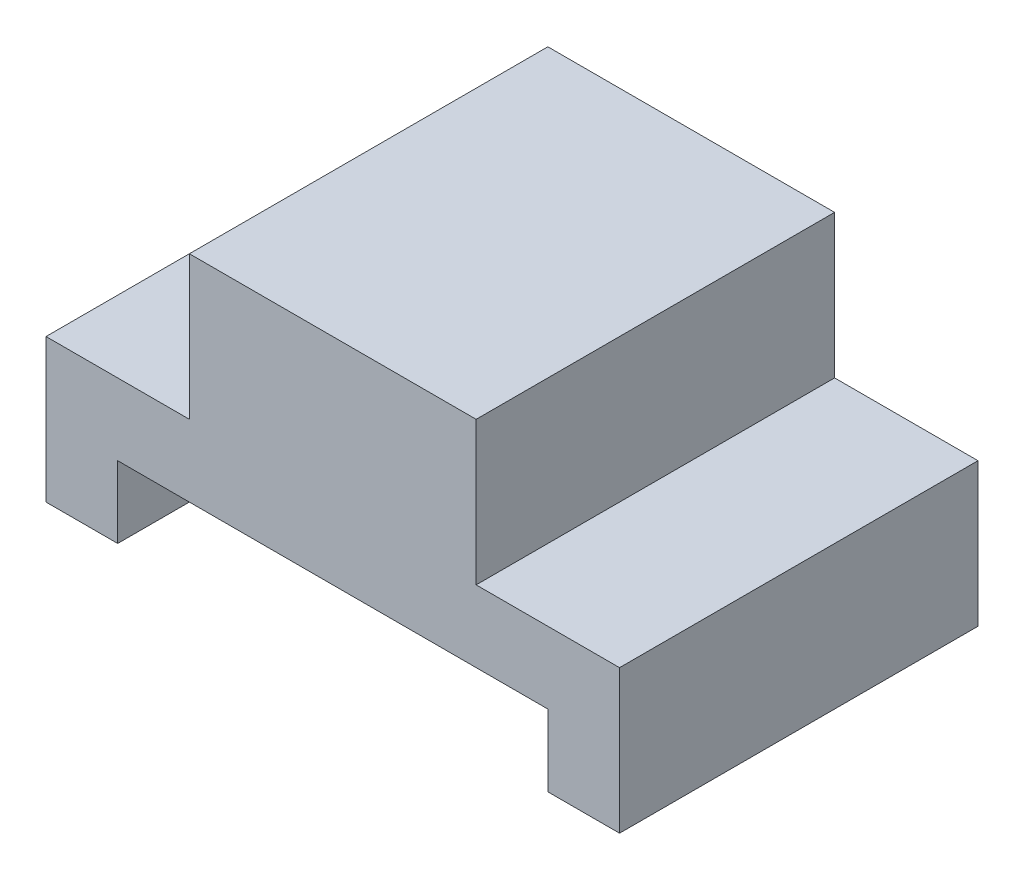
ISO-10303-21;
HEADER;
FILE_DESCRIPTION(('STEP AP214'),'2;1');
FILE_NAME('part.step','',(''),(''),'','','');
FILE_SCHEMA(('AUTOMOTIVE_DESIGN { 1 0 10303 214 1 1 1 1 }'));
ENDSEC;
DATA;
#1=APPLICATION_CONTEXT('core data for automotive mechanical design processes');
#2=APPLICATION_PROTOCOL_DEFINITION('international standard','automotive_design',2000,#1);
#3=PRODUCT_CONTEXT('',#1,'mechanical');
#4=PRODUCT('Part','Part','',(#3));
#5=PRODUCT_RELATED_PRODUCT_CATEGORY('part','',(#4));
#6=PRODUCT_DEFINITION_FORMATION('','',#4);
#7=PRODUCT_DEFINITION_CONTEXT('part definition',#1,'design');
#8=PRODUCT_DEFINITION('design','',#6,#7);
#9=PRODUCT_DEFINITION_SHAPE('','',#8);
#10=(LENGTH_UNIT() NAMED_UNIT(*) SI_UNIT(.MILLI.,.METRE.));
#11=(NAMED_UNIT(*) PLANE_ANGLE_UNIT() SI_UNIT($,.RADIAN.));
#12=(NAMED_UNIT(*) SI_UNIT($,.STERADIAN.) SOLID_ANGLE_UNIT());
#13=UNCERTAINTY_MEASURE_WITH_UNIT(LENGTH_MEASURE(1.E-05),#10,'distance_accuracy_value','');
#14=(GEOMETRIC_REPRESENTATION_CONTEXT(3) GLOBAL_UNCERTAINTY_ASSIGNED_CONTEXT((#13)) GLOBAL_UNIT_ASSIGNED_CONTEXT((#10,
#11,#12)) REPRESENTATION_CONTEXT('',''));
#15=CARTESIAN_POINT('',(0.,0.,0.));
#16=DIRECTION('',(0.,0.,1.));
#17=DIRECTION('',(1.,0.,0.));
#18=AXIS2_PLACEMENT_3D('',#15,#16,#17);
#19=CARTESIAN_POINT('',(0.,0.,0.));
#20=DIRECTION('',(0.,-1.,0.));
#21=DIRECTION('',(0.,0.,-1.));
#22=AXIS2_PLACEMENT_3D('',#19,#20,#21);
#23=PLANE('',#22);
#24=DIRECTION('',(-1.,0.,0.));
#25=VECTOR('',#24,1.);
#26=CARTESIAN_POINT('',(-7950.,0.,-199.46825096806));
#27=LINE('',#26,#25);
#28=CARTESIAN_POINT('',(-950.,0.,-199.46825096806));
#29=VERTEX_POINT('',#28);
#30=CARTESIAN_POINT('',(-6950.,0.,-199.46825096806));
#31=VERTEX_POINT('',#30);
#32=EDGE_CURVE('E53',#29,#31,#27,.T.);
#33=ORIENTED_EDGE('',*,*,#32,.F.);
#34=DIRECTION('',(0.,0.,-1.));
#35=VECTOR('',#34,1.);
#36=CARTESIAN_POINT('',(-950.000000000001,0.,4800.53174903194));
#37=LINE('',#36,#35);
#38=CARTESIAN_POINT('',(-950.000000000001,0.,4800.53174903194));
#39=VERTEX_POINT('',#38);
#40=EDGE_CURVE('E144',#39,#29,#37,.T.);
#41=ORIENTED_EDGE('',*,*,#40,.F.);
#42=DIRECTION('',(1.,0.,0.));
#43=VECTOR('',#42,1.);
#44=CARTESIAN_POINT('',(-7950.,0.,4800.53174903194));
#45=LINE('',#44,#43);
#46=CARTESIAN_POINT('',(-6950.,0.,4800.53174903194));
#47=VERTEX_POINT('',#46);
#48=EDGE_CURVE('E202',#47,#39,#45,.T.);
#49=ORIENTED_EDGE('',*,*,#48,.F.);
#50=DIRECTION('',(0.,0.,1.));
#51=VECTOR('',#50,1.);
#52=CARTESIAN_POINT('',(-6950.,0.,4800.53174903194));
#53=LINE('',#52,#51);
#54=EDGE_CURVE('E148',#31,#47,#53,.T.);
#55=ORIENTED_EDGE('',*,*,#54,.F.);
#56=EDGE_LOOP('',(#33,#41,#49,#55));
#57=FACE_BOUND('',#56,.T.);
#58=ADVANCED_FACE('F38',(#57),#23,.T.);
#59=CARTESIAN_POINT('',(0.,1000.,0.));
#60=DIRECTION('',(0.,-1.,0.));
#61=DIRECTION('',(0.,0.,-1.));
#62=AXIS2_PLACEMENT_3D('',#59,#60,#61);
#63=PLANE('',#62);
#64=DIRECTION('',(0.,0.,1.));
#65=VECTOR('',#64,1.);
#66=CARTESIAN_POINT('',(-5950.,1000.,-199.46825096806));
#67=LINE('',#66,#65);
#68=CARTESIAN_POINT('',(-5950.,1000.,-199.46825096806));
#69=VERTEX_POINT('',#68);
#70=CARTESIAN_POINT('',(-5950.,1000.,4800.53174903194));
#71=VERTEX_POINT('',#70);
#72=EDGE_CURVE('E173',#69,#71,#67,.T.);
#73=ORIENTED_EDGE('',*,*,#72,.F.);
#74=DIRECTION('',(-1.,0.,0.));
#75=VECTOR('',#74,1.);
#76=CARTESIAN_POINT('',(-7950.,1000.,-199.46825096806));
#77=LINE('',#76,#75);
#78=CARTESIAN_POINT('',(-7950.,1000.,-199.46825096806));
#79=VERTEX_POINT('',#78);
#80=EDGE_CURVE('E201',#69,#79,#77,.T.);
#81=ORIENTED_EDGE('',*,*,#80,.T.);
#82=DIRECTION('',(0.,0.,1.));
#83=VECTOR('',#82,1.);
#84=CARTESIAN_POINT('',(-7950.,1000.,4800.53174903194));
#85=LINE('',#84,#83);
#86=CARTESIAN_POINT('',(-7950.,1000.,4800.53174903194));
#87=VERTEX_POINT('',#86);
#88=EDGE_CURVE('E205',#79,#87,#85,.T.);
#89=ORIENTED_EDGE('',*,*,#88,.T.);
#90=DIRECTION('',(1.,0.,0.));
#91=VECTOR('',#90,1.);
#92=CARTESIAN_POINT('',(-7950.,1000.,4800.53174903194));
#93=LINE('',#92,#91);
#94=EDGE_CURVE('E208',#87,#71,#93,.T.);
#95=ORIENTED_EDGE('',*,*,#94,.T.);
#96=EDGE_LOOP('',(#73,#81,#89,#95));
#97=FACE_BOUND('',#96,.T.);
#98=ADVANCED_FACE('F235',(#97),#63,.F.);
#99=DIRECTION('',(0.,0.,-1.));
#100=VECTOR('',#99,1.);
#101=CARTESIAN_POINT('',(-1950.,1000.,-199.46825096806));
#102=LINE('',#101,#100);
#103=CARTESIAN_POINT('',(-1950.,1000.,4800.53174903194));
#104=VERTEX_POINT('',#103);
#105=CARTESIAN_POINT('',(-1950.,1000.,-199.46825096806));
#106=VERTEX_POINT('',#105);
#107=EDGE_CURVE('E61',#104,#106,#102,.T.);
#108=ORIENTED_EDGE('',*,*,#107,.F.);
#109=CARTESIAN_POINT('',(49.9999999999998,1000.,4800.53174903194));
#110=VERTEX_POINT('',#109);
#111=EDGE_CURVE('E207',#104,#110,#93,.T.);
#112=ORIENTED_EDGE('',*,*,#111,.T.);
#113=DIRECTION('',(0.,0.,-1.));
#114=VECTOR('',#113,1.);
#115=CARTESIAN_POINT('',(49.9999999999998,1000.,4800.53174903194));
#116=LINE('',#115,#114);
#117=CARTESIAN_POINT('',(49.9999999999998,1000.,-199.46825096806));
#118=VERTEX_POINT('',#117);
#119=EDGE_CURVE('E198',#110,#118,#116,.T.);
#120=ORIENTED_EDGE('',*,*,#119,.T.);
#121=EDGE_CURVE('E203',#118,#106,#77,.T.);
#122=ORIENTED_EDGE('',*,*,#121,.T.);
#123=EDGE_LOOP('',(#108,#112,#120,#122));
#124=FACE_BOUND('',#123,.T.);
#125=ADVANCED_FACE('F250',(#124),#63,.F.);
#126=CARTESIAN_POINT('',(49.9999999999998,1000.,4800.53174903194));
#127=DIRECTION('',(-1.,0.,0.));
#128=DIRECTION('',(0.,0.,1.));
#129=AXIS2_PLACEMENT_3D('',#126,#127,#128);
#130=PLANE('',#129);
#131=DIRECTION('',(0.,-1.,0.));
#132=VECTOR('',#131,1.);
#133=CARTESIAN_POINT('',(49.9999999999998,1000.,4800.53174903194));
#134=LINE('',#133,#132);
#135=CARTESIAN_POINT('',(49.9999999999998,-1000.,4800.53174903194));
#136=VERTEX_POINT('',#135);
#137=EDGE_CURVE('E210',#110,#136,#134,.T.);
#138=ORIENTED_EDGE('',*,*,#137,.T.);
#139=DIRECTION('',(0.,0.,1.));
#140=VECTOR('',#139,1.);
#141=CARTESIAN_POINT('',(49.9999999999998,-1000.,4800.53174903194));
#142=LINE('',#141,#140);
#143=CARTESIAN_POINT('',(49.9999999999998,-1000.,-199.46825096806));
#144=VERTEX_POINT('',#143);
#145=EDGE_CURVE('E135',#144,#136,#142,.T.);
#146=ORIENTED_EDGE('',*,*,#145,.F.);
#147=DIRECTION('',(0.,-1.,0.));
#148=VECTOR('',#147,1.);
#149=CARTESIAN_POINT('',(49.9999999999998,1000.,-199.46825096806));
#150=LINE('',#149,#148);
#151=EDGE_CURVE('E11',#118,#144,#150,.T.);
#152=ORIENTED_EDGE('',*,*,#151,.F.);
#153=ORIENTED_EDGE('',*,*,#119,.F.);
#154=EDGE_LOOP('',(#138,#146,#152,#153));
#155=FACE_BOUND('',#154,.T.);
#156=ADVANCED_FACE('F40',(#155),#130,.F.);
#157=CARTESIAN_POINT('',(-7950.,1000.,-199.46825096806));
#158=DIRECTION('',(0.,0.,1.));
#159=DIRECTION('',(1.,0.,0.));
#160=AXIS2_PLACEMENT_3D('',#157,#158,#159);
#161=PLANE('',#160);
#162=ORIENTED_EDGE('',*,*,#151,.T.);
#163=DIRECTION('',(1.,0.,0.));
#164=VECTOR('',#163,1.);
#165=CARTESIAN_POINT('',(-950.,-1000.,-199.46825096806));
#166=LINE('',#165,#164);
#167=CARTESIAN_POINT('',(-950.,-1000.,-199.46825096806));
#168=VERTEX_POINT('',#167);
#169=EDGE_CURVE('E125',#168,#144,#166,.T.);
#170=ORIENTED_EDGE('',*,*,#169,.F.);
#171=DIRECTION('',(0.,1.,0.));
#172=VECTOR('',#171,1.);
#173=CARTESIAN_POINT('',(-950.,-1000.,-199.46825096806));
#174=LINE('',#173,#172);
#175=EDGE_CURVE('E129',#168,#29,#174,.T.);
#176=ORIENTED_EDGE('',*,*,#175,.T.);
#177=ORIENTED_EDGE('',*,*,#32,.T.);
#178=DIRECTION('',(0.,1.,0.));
#179=VECTOR('',#178,1.);
#180=CARTESIAN_POINT('',(-6950.,-1000.,-199.46825096806));
#181=LINE('',#180,#179);
#182=CARTESIAN_POINT('',(-6950.,-1000.,-199.46825096806));
#183=VERTEX_POINT('',#182);
#184=EDGE_CURVE('E166',#183,#31,#181,.T.);
#185=ORIENTED_EDGE('',*,*,#184,.F.);
#186=DIRECTION('',(1.,0.,0.));
#187=VECTOR('',#186,1.);
#188=CARTESIAN_POINT('',(-6950.,-1000.,-199.46825096806));
#189=LINE('',#188,#187);
#190=CARTESIAN_POINT('',(-7950.,-1000.,-199.46825096806));
#191=VERTEX_POINT('',#190);
#192=EDGE_CURVE('E165',#191,#183,#189,.T.);
#193=ORIENTED_EDGE('',*,*,#192,.F.);
#194=DIRECTION('',(0.,-1.,0.));
#195=VECTOR('',#194,1.);
#196=CARTESIAN_POINT('',(-7950.,1000.,-199.46825096806));
#197=LINE('',#196,#195);
#198=EDGE_CURVE('E46',#79,#191,#197,.T.);
#199=ORIENTED_EDGE('',*,*,#198,.F.);
#200=ORIENTED_EDGE('',*,*,#80,.F.);
#201=DIRECTION('',(0.,-1.,0.));
#202=VECTOR('',#201,1.);
#203=CARTESIAN_POINT('',(-5950.,3000.,-199.46825096806));
#204=LINE('',#203,#202);
#205=CARTESIAN_POINT('',(-5950.,3000.,-199.46825096806));
#206=VERTEX_POINT('',#205);
#207=EDGE_CURVE('E183',#206,#69,#204,.T.);
#208=ORIENTED_EDGE('',*,*,#207,.F.);
#209=DIRECTION('',(-1.,0.,0.));
#210=VECTOR('',#209,1.);
#211=CARTESIAN_POINT('',(-5950.,3000.,-199.46825096806));
#212=LINE('',#211,#210);
#213=CARTESIAN_POINT('',(-1950.,3000.,-199.46825096806));
#214=VERTEX_POINT('',#213);
#215=EDGE_CURVE('E181',#214,#206,#212,.T.);
#216=ORIENTED_EDGE('',*,*,#215,.F.);
#217=DIRECTION('',(0.,-1.,0.));
#218=VECTOR('',#217,1.);
#219=CARTESIAN_POINT('',(-1950.,3000.,-199.46825096806));
#220=LINE('',#219,#218);
#221=EDGE_CURVE('E189',#214,#106,#220,.T.);
#222=ORIENTED_EDGE('',*,*,#221,.T.);
#223=ORIENTED_EDGE('',*,*,#121,.F.);
#224=EDGE_LOOP('',(#162,#170,#176,#177,#185,#193,#199,#200,#208,#216,#222,#223));
#225=FACE_BOUND('',#224,.T.);
#226=ADVANCED_FACE('F127',(#225),#161,.F.);
#227=CARTESIAN_POINT('',(-7950.,1000.,4800.53174903194));
#228=DIRECTION('',(1.,0.,0.));
#229=DIRECTION('',(0.,0.,-1.));
#230=AXIS2_PLACEMENT_3D('',#227,#228,#229);
#231=PLANE('',#230);
#232=ORIENTED_EDGE('',*,*,#198,.T.);
#233=DIRECTION('',(0.,0.,-1.));
#234=VECTOR('',#233,1.);
#235=CARTESIAN_POINT('',(-7950.,-1000.,4800.53174903194));
#236=LINE('',#235,#234);
#237=CARTESIAN_POINT('',(-7950.,-1000.,4800.53174903194));
#238=VERTEX_POINT('',#237);
#239=EDGE_CURVE('E162',#238,#191,#236,.T.);
#240=ORIENTED_EDGE('',*,*,#239,.F.);
#241=DIRECTION('',(0.,-1.,0.));
#242=VECTOR('',#241,1.);
#243=CARTESIAN_POINT('',(-7950.,1000.,4800.53174903194));
#244=LINE('',#243,#242);
#245=EDGE_CURVE('E215',#87,#238,#244,.T.);
#246=ORIENTED_EDGE('',*,*,#245,.F.);
#247=ORIENTED_EDGE('',*,*,#88,.F.);
#248=EDGE_LOOP('',(#232,#240,#246,#247));
#249=FACE_BOUND('',#248,.T.);
#250=ADVANCED_FACE('F220',(#249),#231,.F.);
#251=CARTESIAN_POINT('',(-7950.,1000.,4800.53174903194));
#252=DIRECTION('',(0.,0.,-1.));
#253=DIRECTION('',(-1.,0.,0.));
#254=AXIS2_PLACEMENT_3D('',#251,#252,#253);
#255=PLANE('',#254);
#256=ORIENTED_EDGE('',*,*,#245,.T.);
#257=DIRECTION('',(-1.,0.,0.));
#258=VECTOR('',#257,1.);
#259=CARTESIAN_POINT('',(-6950.,-1000.,4800.53174903194));
#260=LINE('',#259,#258);
#261=CARTESIAN_POINT('',(-6950.,-1000.,4800.53174903194));
#262=VERTEX_POINT('',#261);
#263=EDGE_CURVE('E159',#262,#238,#260,.T.);
#264=ORIENTED_EDGE('',*,*,#263,.F.);
#265=DIRECTION('',(0.,1.,0.));
#266=VECTOR('',#265,1.);
#267=CARTESIAN_POINT('',(-6950.,-1000.,4800.53174903194));
#268=LINE('',#267,#266);
#269=EDGE_CURVE('E170',#262,#47,#268,.T.);
#270=ORIENTED_EDGE('',*,*,#269,.T.);
#271=ORIENTED_EDGE('',*,*,#48,.T.);
#272=DIRECTION('',(0.,1.,0.));
#273=VECTOR('',#272,1.);
#274=CARTESIAN_POINT('',(-950.000000000001,-1000.,4800.53174903194));
#275=LINE('',#274,#273);
#276=CARTESIAN_POINT('',(-950.000000000001,-1000.,4800.53174903194));
#277=VERTEX_POINT('',#276);
#278=EDGE_CURVE('E149',#277,#39,#275,.T.);
#279=ORIENTED_EDGE('',*,*,#278,.F.);
#280=DIRECTION('',(-1.,0.,0.));
#281=VECTOR('',#280,1.);
#282=CARTESIAN_POINT('',(-950.000000000001,-1000.,4800.53174903194));
#283=LINE('',#282,#281);
#284=EDGE_CURVE('E141',#136,#277,#283,.T.);
#285=ORIENTED_EDGE('',*,*,#284,.F.);
#286=ORIENTED_EDGE('',*,*,#137,.F.);
#287=ORIENTED_EDGE('',*,*,#111,.F.);
#288=DIRECTION('',(0.,-1.,0.));
#289=VECTOR('',#288,1.);
#290=CARTESIAN_POINT('',(-1950.,3000.,4800.53174903194));
#291=LINE('',#290,#289);
#292=CARTESIAN_POINT('',(-1950.,3000.,4800.53174903194));
#293=VERTEX_POINT('',#292);
#294=EDGE_CURVE('E192',#293,#104,#291,.T.);
#295=ORIENTED_EDGE('',*,*,#294,.F.);
#296=DIRECTION('',(1.,0.,0.));
#297=VECTOR('',#296,1.);
#298=CARTESIAN_POINT('',(-5950.,3000.,4800.53174903194));
#299=LINE('',#298,#297);
#300=CARTESIAN_POINT('',(-5950.,3000.,4800.53174903194));
#301=VERTEX_POINT('',#300);
#302=EDGE_CURVE('E177',#301,#293,#299,.T.);
#303=ORIENTED_EDGE('',*,*,#302,.F.);
#304=DIRECTION('',(0.,-1.,0.));
#305=VECTOR('',#304,1.);
#306=CARTESIAN_POINT('',(-5950.,3000.,4800.53174903194));
#307=LINE('',#306,#305);
#308=EDGE_CURVE('E195',#301,#71,#307,.T.);
#309=ORIENTED_EDGE('',*,*,#308,.T.);
#310=ORIENTED_EDGE('',*,*,#94,.F.);
#311=EDGE_LOOP('',(#256,#264,#270,#271,#279,#285,#286,#287,#295,#303,#309,#310));
#312=FACE_BOUND('',#311,.T.);
#313=ADVANCED_FACE('F231',(#312),#255,.F.);
#314=CARTESIAN_POINT('',(-5950.,3000.,-199.46825096806));
#315=DIRECTION('',(1.,0.,0.));
#316=DIRECTION('',(0.,0.,-1.));
#317=AXIS2_PLACEMENT_3D('',#314,#315,#316);
#318=PLANE('',#317);
#319=ORIENTED_EDGE('',*,*,#72,.T.);
#320=ORIENTED_EDGE('',*,*,#308,.F.);
#321=DIRECTION('',(0.,0.,1.));
#322=VECTOR('',#321,1.);
#323=CARTESIAN_POINT('',(-5950.,3000.,-199.46825096806));
#324=LINE('',#323,#322);
#325=EDGE_CURVE('E174',#206,#301,#324,.T.);
#326=ORIENTED_EDGE('',*,*,#325,.F.);
#327=ORIENTED_EDGE('',*,*,#207,.T.);
#328=EDGE_LOOP('',(#319,#320,#326,#327));
#329=FACE_BOUND('',#328,.T.);
#330=ADVANCED_FACE('F240',(#329),#318,.F.);
#331=CARTESIAN_POINT('',(-1950.,3000.,-199.46825096806));
#332=DIRECTION('',(-1.,0.,0.));
#333=DIRECTION('',(0.,0.,1.));
#334=AXIS2_PLACEMENT_3D('',#331,#332,#333);
#335=PLANE('',#334);
#336=ORIENTED_EDGE('',*,*,#107,.T.);
#337=ORIENTED_EDGE('',*,*,#221,.F.);
#338=DIRECTION('',(0.,0.,-1.));
#339=VECTOR('',#338,1.);
#340=CARTESIAN_POINT('',(-1950.,3000.,-199.46825096806));
#341=LINE('',#340,#339);
#342=EDGE_CURVE('E179',#293,#214,#341,.T.);
#343=ORIENTED_EDGE('',*,*,#342,.F.);
#344=ORIENTED_EDGE('',*,*,#294,.T.);
#345=EDGE_LOOP('',(#336,#337,#343,#344));
#346=FACE_BOUND('',#345,.T.);
#347=ADVANCED_FACE('F247',(#346),#335,.F.);
#348=CARTESIAN_POINT('',(0.,3000.,0.));
#349=DIRECTION('',(0.,1.,0.));
#350=DIRECTION('',(0.,0.,1.));
#351=AXIS2_PLACEMENT_3D('',#348,#349,#350);
#352=PLANE('',#351);
#353=ORIENTED_EDGE('',*,*,#325,.T.);
#354=ORIENTED_EDGE('',*,*,#302,.T.);
#355=ORIENTED_EDGE('',*,*,#342,.T.);
#356=ORIENTED_EDGE('',*,*,#215,.T.);
#357=EDGE_LOOP('',(#353,#354,#355,#356));
#358=FACE_BOUND('',#357,.T.);
#359=ADVANCED_FACE('F242',(#358),#352,.T.);
#360=CARTESIAN_POINT('',(-6950.,-1000.,4800.53174903194));
#361=DIRECTION('',(-1.,0.,0.));
#362=DIRECTION('',(0.,0.,1.));
#363=AXIS2_PLACEMENT_3D('',#360,#361,#362);
#364=PLANE('',#363);
#365=ORIENTED_EDGE('',*,*,#54,.T.);
#366=ORIENTED_EDGE('',*,*,#269,.F.);
#367=DIRECTION('',(0.,0.,1.));
#368=VECTOR('',#367,1.);
#369=CARTESIAN_POINT('',(-6950.,-1000.,4800.53174903194));
#370=LINE('',#369,#368);
#371=EDGE_CURVE('E152',#183,#262,#370,.T.);
#372=ORIENTED_EDGE('',*,*,#371,.F.);
#373=ORIENTED_EDGE('',*,*,#184,.T.);
#374=EDGE_LOOP('',(#365,#366,#372,#373));
#375=FACE_BOUND('',#374,.T.);
#376=ADVANCED_FACE('F229',(#375),#364,.F.);
#377=CARTESIAN_POINT('',(0.,-1000.,0.));
#378=DIRECTION('',(0.,1.,0.));
#379=DIRECTION('',(0.,0.,1.));
#380=AXIS2_PLACEMENT_3D('',#377,#378,#379);
#381=PLANE('',#380);
#382=ORIENTED_EDGE('',*,*,#371,.T.);
#383=ORIENTED_EDGE('',*,*,#263,.T.);
#384=ORIENTED_EDGE('',*,*,#239,.T.);
#385=ORIENTED_EDGE('',*,*,#192,.T.);
#386=EDGE_LOOP('',(#382,#383,#384,#385));
#387=FACE_BOUND('',#386,.T.);
#388=ADVANCED_FACE('F225',(#387),#381,.F.);
#389=CARTESIAN_POINT('',(-950.000000000001,-1000.,4800.53174903194));
#390=DIRECTION('',(1.,0.,0.));
#391=DIRECTION('',(0.,0.,-1.));
#392=AXIS2_PLACEMENT_3D('',#389,#390,#391);
#393=PLANE('',#392);
#394=ORIENTED_EDGE('',*,*,#40,.T.);
#395=ORIENTED_EDGE('',*,*,#175,.F.);
#396=DIRECTION('',(0.,0.,-1.));
#397=VECTOR('',#396,1.);
#398=CARTESIAN_POINT('',(-950.000000000001,-1000.,4800.53174903194));
#399=LINE('',#398,#397);
#400=EDGE_CURVE('E136',#277,#168,#399,.T.);
#401=ORIENTED_EDGE('',*,*,#400,.F.);
#402=ORIENTED_EDGE('',*,*,#278,.T.);
#403=EDGE_LOOP('',(#394,#395,#401,#402));
#404=FACE_BOUND('',#403,.T.);
#405=ADVANCED_FACE('F146',(#404),#393,.F.);
#406=CARTESIAN_POINT('',(0.,-1000.,0.));
#407=DIRECTION('',(0.,-1.,0.));
#408=DIRECTION('',(0.,0.,-1.));
#409=AXIS2_PLACEMENT_3D('',#406,#407,#408);
#410=PLANE('',#409);
#411=ORIENTED_EDGE('',*,*,#400,.T.);
#412=ORIENTED_EDGE('',*,*,#169,.T.);
#413=ORIENTED_EDGE('',*,*,#145,.T.);
#414=ORIENTED_EDGE('',*,*,#284,.T.);
#415=EDGE_LOOP('',(#411,#412,#413,#414));
#416=FACE_BOUND('',#415,.T.);
#417=ADVANCED_FACE('F139',(#416),#410,.T.);
#418=CLOSED_SHELL('',(#58,#98,#125,#156,#226,#250,#313,#330,#347,#359,#376,#388,#405,#417));
#419=MANIFOLD_SOLID_BREP('B2',#418);
#420=ADVANCED_BREP_SHAPE_REPRESENTATION('',(#18,#419),#14);
#421=SHAPE_DEFINITION_REPRESENTATION(#9,#420);
ENDSEC;
END-ISO-10303-21;
